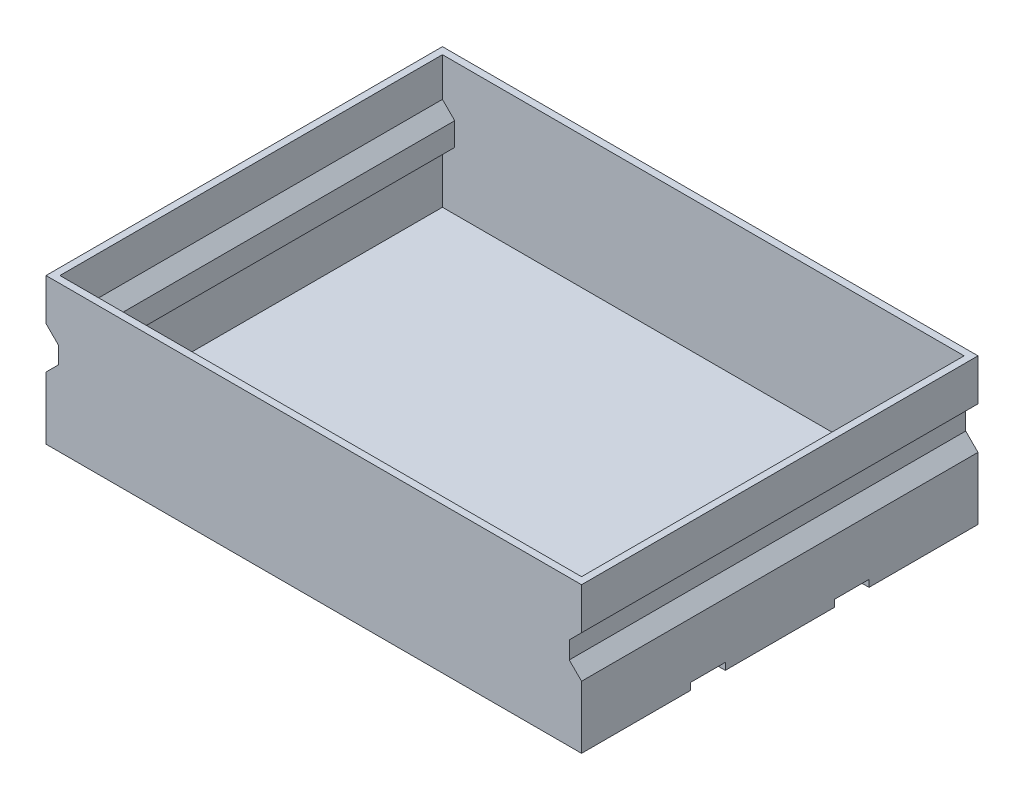
ISO-10303-21;
HEADER;
FILE_DESCRIPTION(('STEP AP214'),'2;1');
FILE_NAME('part.step','',(''),(''),'','','');
FILE_SCHEMA(('AUTOMOTIVE_DESIGN { 1 0 10303 214 1 1 1 1 }'));
ENDSEC;
DATA;
#1=APPLICATION_CONTEXT('core data for automotive mechanical design processes');
#2=APPLICATION_PROTOCOL_DEFINITION('international standard','automotive_design',2000,#1);
#3=PRODUCT_CONTEXT('',#1,'mechanical');
#4=PRODUCT('Part','Part','',(#3));
#5=PRODUCT_RELATED_PRODUCT_CATEGORY('part','',(#4));
#6=PRODUCT_DEFINITION_FORMATION('','',#4);
#7=PRODUCT_DEFINITION_CONTEXT('part definition',#1,'design');
#8=PRODUCT_DEFINITION('design','',#6,#7);
#9=PRODUCT_DEFINITION_SHAPE('','',#8);
#10=(LENGTH_UNIT() NAMED_UNIT(*) SI_UNIT(.MILLI.,.METRE.));
#11=(NAMED_UNIT(*) PLANE_ANGLE_UNIT() SI_UNIT($,.RADIAN.));
#12=(NAMED_UNIT(*) SI_UNIT($,.STERADIAN.) SOLID_ANGLE_UNIT());
#13=UNCERTAINTY_MEASURE_WITH_UNIT(LENGTH_MEASURE(1.E-05),#10,'distance_accuracy_value','');
#14=(GEOMETRIC_REPRESENTATION_CONTEXT(3) GLOBAL_UNCERTAINTY_ASSIGNED_CONTEXT((#13)) GLOBAL_UNIT_ASSIGNED_CONTEXT((#10,
#11,#12)) REPRESENTATION_CONTEXT('',''));
#15=CARTESIAN_POINT('',(0.,0.,0.));
#16=DIRECTION('',(0.,0.,1.));
#17=DIRECTION('',(1.,0.,0.));
#18=AXIS2_PLACEMENT_3D('',#15,#16,#17);
#19=CARTESIAN_POINT('',(0.,-2.,0.));
#20=DIRECTION('',(0.,1.,0.));
#21=DIRECTION('',(0.,0.,1.));
#22=AXIS2_PLACEMENT_3D('',#19,#20,#21);
#23=PLANE('',#22);
#24=DIRECTION('',(1.,0.,0.));
#25=VECTOR('',#24,1.);
#26=CARTESIAN_POINT('',(-77.,-2.,25.6666666666667));
#27=LINE('',#26,#25);
#28=CARTESIAN_POINT('',(-77.,-2.,25.6666666666667));
#29=VERTEX_POINT('',#28);
#30=CARTESIAN_POINT('',(77.,-2.,25.6666666666667));
#31=VERTEX_POINT('',#30);
#32=EDGE_CURVE('E266',#29,#31,#27,.T.);
#33=ORIENTED_EDGE('',*,*,#32,.F.);
#34=DIRECTION('',(0.,0.,1.));
#35=VECTOR('',#34,1.);
#36=CARTESIAN_POINT('',(-77.,-2.,0.));
#37=LINE('',#36,#35);
#38=CARTESIAN_POINT('',(-77.,-2.,15.6666666666667));
#39=VERTEX_POINT('',#38);
#40=EDGE_CURVE('E270',#39,#29,#37,.T.);
#41=ORIENTED_EDGE('',*,*,#40,.F.);
#42=DIRECTION('',(-1.,0.,0.));
#43=VECTOR('',#42,1.);
#44=CARTESIAN_POINT('',(-77.,-2.,15.6666666666667));
#45=LINE('',#44,#43);
#46=CARTESIAN_POINT('',(77.,-2.,15.6666666666667));
#47=VERTEX_POINT('',#46);
#48=EDGE_CURVE('E273',#47,#39,#45,.T.);
#49=ORIENTED_EDGE('',*,*,#48,.F.);
#50=DIRECTION('',(0.,0.,1.));
#51=VECTOR('',#50,1.);
#52=CARTESIAN_POINT('',(77.,-2.,0.));
#53=LINE('',#52,#51);
#54=EDGE_CURVE('E439',#47,#31,#53,.T.);
#55=ORIENTED_EDGE('',*,*,#54,.T.);
#56=EDGE_LOOP('',(#33,#41,#49,#55));
#57=FACE_BOUND('',#56,.T.);
#58=ADVANCED_FACE('F35',(#57),#23,.F.);
#59=DIRECTION('',(1.,0.,0.));
#60=VECTOR('',#59,1.);
#61=CARTESIAN_POINT('',(-77.,-2.,-15.6666666666667));
#62=LINE('',#61,#60);
#63=CARTESIAN_POINT('',(-77.,-2.,-15.6666666666667));
#64=VERTEX_POINT('',#63);
#65=CARTESIAN_POINT('',(77.,-2.,-15.6666666666667));
#66=VERTEX_POINT('',#65);
#67=EDGE_CURVE('E271',#64,#66,#62,.T.);
#68=ORIENTED_EDGE('',*,*,#67,.F.);
#69=CARTESIAN_POINT('',(-77.,-2.,-25.6666666666667));
#70=VERTEX_POINT('',#69);
#71=EDGE_CURVE('E476',#70,#64,#37,.T.);
#72=ORIENTED_EDGE('',*,*,#71,.F.);
#73=DIRECTION('',(-1.,0.,0.));
#74=VECTOR('',#73,1.);
#75=CARTESIAN_POINT('',(-77.,-2.,-25.6666666666667));
#76=LINE('',#75,#74);
#77=CARTESIAN_POINT('',(77.,-2.,-25.6666666666667));
#78=VERTEX_POINT('',#77);
#79=EDGE_CURVE('E60',#78,#70,#76,.T.);
#80=ORIENTED_EDGE('',*,*,#79,.F.);
#81=EDGE_CURVE('E474',#78,#66,#53,.T.);
#82=ORIENTED_EDGE('',*,*,#81,.T.);
#83=EDGE_LOOP('',(#68,#72,#80,#82));
#84=FACE_BOUND('',#83,.T.);
#85=ADVANCED_FACE('F517',(#84),#23,.F.);
#86=CARTESIAN_POINT('',(0.,0.,0.));
#87=DIRECTION('',(0.,1.,0.));
#88=DIRECTION('',(0.,0.,1.));
#89=AXIS2_PLACEMENT_3D('',#86,#87,#88);
#90=PLANE('',#89);
#91=DIRECTION('',(-1.,0.,0.));
#92=VECTOR('',#91,1.);
#93=CARTESIAN_POINT('',(-74.9999999999991,0.,55.));
#94=LINE('',#93,#92);
#95=CARTESIAN_POINT('',(74.9999999999991,0.,55.));
#96=VERTEX_POINT('',#95);
#97=CARTESIAN_POINT('',(-74.9999999999991,0.,55.));
#98=VERTEX_POINT('',#97);
#99=EDGE_CURVE('E327',#96,#98,#94,.T.);
#100=ORIENTED_EDGE('',*,*,#99,.F.);
#101=DIRECTION('',(0.,0.,-1.));
#102=VECTOR('',#101,1.);
#103=CARTESIAN_POINT('',(74.9999999999991,0.,95.401069459375));
#104=LINE('',#103,#102);
#105=CARTESIAN_POINT('',(74.9999999999991,0.,-55.));
#106=VERTEX_POINT('',#105);
#107=EDGE_CURVE('E415',#96,#106,#104,.T.);
#108=ORIENTED_EDGE('',*,*,#107,.T.);
#109=DIRECTION('',(-1.,0.,0.));
#110=VECTOR('',#109,1.);
#111=CARTESIAN_POINT('',(-74.9999999999991,0.,-55.));
#112=LINE('',#111,#110);
#113=CARTESIAN_POINT('',(-74.9999999999991,0.,-55.));
#114=VERTEX_POINT('',#113);
#115=EDGE_CURVE('E352',#106,#114,#112,.T.);
#116=ORIENTED_EDGE('',*,*,#115,.T.);
#117=DIRECTION('',(0.,0.,-1.));
#118=VECTOR('',#117,1.);
#119=CARTESIAN_POINT('',(-74.9999999999991,0.,95.401069459375));
#120=LINE('',#119,#118);
#121=EDGE_CURVE('E435',#98,#114,#120,.T.);
#122=ORIENTED_EDGE('',*,*,#121,.F.);
#123=EDGE_LOOP('',(#100,#108,#116,#122));
#124=FACE_BOUND('',#123,.T.);
#125=ADVANCED_FACE('F539',(#124),#90,.T.);
#126=CARTESIAN_POINT('',(77.,-2.,0.));
#127=DIRECTION('',(-1.,0.,0.));
#128=DIRECTION('',(0.,0.,1.));
#129=AXIS2_PLACEMENT_3D('',#126,#127,#128);
#130=PLANE('',#129);
#131=DIRECTION('',(0.,1.,0.));
#132=VECTOR('',#131,1.);
#133=CARTESIAN_POINT('',(77.,-2.,-57.));
#134=LINE('',#133,#132);
#135=CARTESIAN_POINT('',(77.,-4.,-57.));
#136=VERTEX_POINT('',#135);
#137=CARTESIAN_POINT('',(77.,13.9644660940671,-57.));
#138=VERTEX_POINT('',#137);
#139=EDGE_CURVE('E39',#136,#138,#134,.T.);
#140=ORIENTED_EDGE('',*,*,#139,.T.);
#141=DIRECTION('',(0.,0.,-1.));
#142=VECTOR('',#141,1.);
#143=CARTESIAN_POINT('',(77.,13.9644660940671,95.401069459375));
#144=LINE('',#143,#142);
#145=CARTESIAN_POINT('',(77.,13.9644660940671,57.));
#146=VERTEX_POINT('',#145);
#147=EDGE_CURVE('E417',#146,#138,#144,.T.);
#148=ORIENTED_EDGE('',*,*,#147,.F.);
#149=DIRECTION('',(0.,1.,0.));
#150=VECTOR('',#149,1.);
#151=CARTESIAN_POINT('',(77.,-2.,57.));
#152=LINE('',#151,#150);
#153=CARTESIAN_POINT('',(77.,-4.,57.));
#154=VERTEX_POINT('',#153);
#155=EDGE_CURVE('E11',#154,#146,#152,.T.);
#156=ORIENTED_EDGE('',*,*,#155,.F.);
#157=DIRECTION('',(0.,0.,1.));
#158=VECTOR('',#157,1.);
#159=CARTESIAN_POINT('',(77.,-4.,25.6666666666667));
#160=LINE('',#159,#158);
#161=CARTESIAN_POINT('',(77.,-4.,25.6666666666667));
#162=VERTEX_POINT('',#161);
#163=EDGE_CURVE('E258',#162,#154,#160,.T.);
#164=ORIENTED_EDGE('',*,*,#163,.F.);
#165=DIRECTION('',(0.,1.,0.));
#166=VECTOR('',#165,1.);
#167=CARTESIAN_POINT('',(77.,-4.,25.6666666666667));
#168=LINE('',#167,#166);
#169=EDGE_CURVE('E254',#162,#31,#168,.T.);
#170=ORIENTED_EDGE('',*,*,#169,.T.);
#171=ORIENTED_EDGE('',*,*,#54,.F.);
#172=DIRECTION('',(0.,1.,0.));
#173=VECTOR('',#172,1.);
#174=CARTESIAN_POINT('',(77.,-4.,15.6666666666667));
#175=LINE('',#174,#173);
#176=CARTESIAN_POINT('',(77.,-4.,15.6666666666667));
#177=VERTEX_POINT('',#176);
#178=EDGE_CURVE('E289',#177,#47,#175,.T.);
#179=ORIENTED_EDGE('',*,*,#178,.F.);
#180=DIRECTION('',(0.,0.,1.));
#181=VECTOR('',#180,1.);
#182=CARTESIAN_POINT('',(77.,-4.,-15.6666666666667));
#183=LINE('',#182,#181);
#184=CARTESIAN_POINT('',(77.,-4.,-15.6666666666667));
#185=VERTEX_POINT('',#184);
#186=EDGE_CURVE('E283',#185,#177,#183,.T.);
#187=ORIENTED_EDGE('',*,*,#186,.F.);
#188=DIRECTION('',(0.,1.,0.));
#189=VECTOR('',#188,1.);
#190=CARTESIAN_POINT('',(77.,-4.,-15.6666666666667));
#191=LINE('',#190,#189);
#192=EDGE_CURVE('E291',#185,#66,#191,.T.);
#193=ORIENTED_EDGE('',*,*,#192,.T.);
#194=ORIENTED_EDGE('',*,*,#81,.F.);
#195=DIRECTION('',(0.,1.,0.));
#196=VECTOR('',#195,1.);
#197=CARTESIAN_POINT('',(77.,-4.,-25.6666666666667));
#198=LINE('',#197,#196);
#199=CARTESIAN_POINT('',(77.,-4.,-25.6666666666667));
#200=VERTEX_POINT('',#199);
#201=EDGE_CURVE('E310',#200,#78,#198,.T.);
#202=ORIENTED_EDGE('',*,*,#201,.F.);
#203=DIRECTION('',(0.,0.,1.));
#204=VECTOR('',#203,1.);
#205=CARTESIAN_POINT('',(77.,-4.,-57.));
#206=LINE('',#205,#204);
#207=EDGE_CURVE('E302',#136,#200,#206,.T.);
#208=ORIENTED_EDGE('',*,*,#207,.F.);
#209=EDGE_LOOP('',(#140,#148,#156,#164,#170,#171,#179,#187,#193,#194,#202,#208));
#210=FACE_BOUND('',#209,.T.);
#211=ADVANCED_FACE('F37',(#210),#130,.F.);
#212=CARTESIAN_POINT('',(0.,-2.,57.));
#213=DIRECTION('',(0.,0.,1.));
#214=DIRECTION('',(1.,0.,0.));
#215=AXIS2_PLACEMENT_3D('',#212,#213,#214);
#216=PLANE('',#215);
#217=DIRECTION('',(0.,1.,0.));
#218=VECTOR('',#217,1.);
#219=CARTESIAN_POINT('',(76.9999999999998,26.0355339059327,57.));
#220=LINE('',#219,#218);
#221=CARTESIAN_POINT('',(76.9999999999998,26.0355339059327,57.));
#222=VERTEX_POINT('',#221);
#223=CARTESIAN_POINT('',(77.,38.,57.));
#224=VERTEX_POINT('',#223);
#225=EDGE_CURVE('E390',#222,#224,#220,.T.);
#226=ORIENTED_EDGE('',*,*,#225,.T.);
#227=DIRECTION('',(-1.,0.,0.));
#228=VECTOR('',#227,1.);
#229=CARTESIAN_POINT('',(-77.,38.,57.));
#230=LINE('',#229,#228);
#231=CARTESIAN_POINT('',(-77.,38.,57.));
#232=VERTEX_POINT('',#231);
#233=EDGE_CURVE('E449',#224,#232,#230,.T.);
#234=ORIENTED_EDGE('',*,*,#233,.T.);
#235=DIRECTION('',(0.,-1.,0.));
#236=VECTOR('',#235,1.);
#237=CARTESIAN_POINT('',(-76.9999999999998,26.0355339059328,57.));
#238=LINE('',#237,#236);
#239=CARTESIAN_POINT('',(-76.9999999999998,26.0355339059328,57.));
#240=VERTEX_POINT('',#239);
#241=EDGE_CURVE('E446',#232,#240,#238,.T.);
#242=ORIENTED_EDGE('',*,*,#241,.T.);
#243=DIRECTION('',(0.707106781186543,-0.707106781186552,0.));
#244=VECTOR('',#243,1.);
#245=CARTESIAN_POINT('',(-73.4644660940671,22.5,57.));
#246=LINE('',#245,#244);
#247=CARTESIAN_POINT('',(-73.4644660940671,22.5,57.));
#248=VERTEX_POINT('',#247);
#249=EDGE_CURVE('E443',#240,#248,#246,.T.);
#250=ORIENTED_EDGE('',*,*,#249,.T.);
#251=DIRECTION('',(0.,-1.,0.));
#252=VECTOR('',#251,1.);
#253=CARTESIAN_POINT('',(-73.4644660940671,17.5,57.));
#254=LINE('',#253,#252);
#255=CARTESIAN_POINT('',(-73.4644660940671,17.5,57.));
#256=VERTEX_POINT('',#255);
#257=EDGE_CURVE('E440',#248,#256,#254,.T.);
#258=ORIENTED_EDGE('',*,*,#257,.T.);
#259=DIRECTION('',(-0.707106781186552,-0.707106781186543,0.));
#260=VECTOR('',#259,1.);
#261=CARTESIAN_POINT('',(-77.,13.9644660940671,57.));
#262=LINE('',#261,#260);
#263=CARTESIAN_POINT('',(-77.,13.9644660940671,57.));
#264=VERTEX_POINT('',#263);
#265=EDGE_CURVE('E436',#256,#264,#262,.T.);
#266=ORIENTED_EDGE('',*,*,#265,.T.);
#267=DIRECTION('',(0.,1.,0.));
#268=VECTOR('',#267,1.);
#269=CARTESIAN_POINT('',(-77.,-2.,57.));
#270=LINE('',#269,#268);
#271=CARTESIAN_POINT('',(-77.,-4.,57.));
#272=VERTEX_POINT('',#271);
#273=EDGE_CURVE('E44',#272,#264,#270,.T.);
#274=ORIENTED_EDGE('',*,*,#273,.F.);
#275=DIRECTION('',(-1.,0.,0.));
#276=VECTOR('',#275,1.);
#277=CARTESIAN_POINT('',(-77.,-4.,57.));
#278=LINE('',#277,#276);
#279=EDGE_CURVE('E265',#154,#272,#278,.T.);
#280=ORIENTED_EDGE('',*,*,#279,.F.);
#281=ORIENTED_EDGE('',*,*,#155,.T.);
#282=DIRECTION('',(-0.707106781186559,0.707106781186537,0.));
#283=VECTOR('',#282,1.);
#284=CARTESIAN_POINT('',(77.,13.9644660940671,57.));
#285=LINE('',#284,#283);
#286=CARTESIAN_POINT('',(73.4644660940671,17.5,57.));
#287=VERTEX_POINT('',#286);
#288=EDGE_CURVE('E386',#146,#287,#285,.T.);
#289=ORIENTED_EDGE('',*,*,#288,.T.);
#290=DIRECTION('',(0.,1.,0.));
#291=VECTOR('',#290,1.);
#292=CARTESIAN_POINT('',(73.4644660940671,17.5,57.));
#293=LINE('',#292,#291);
#294=CARTESIAN_POINT('',(73.4644660940671,22.5,57.));
#295=VERTEX_POINT('',#294);
#296=EDGE_CURVE('E396',#287,#295,#293,.T.);
#297=ORIENTED_EDGE('',*,*,#296,.T.);
#298=DIRECTION('',(0.70710678118655,0.707106781186545,0.));
#299=VECTOR('',#298,1.);
#300=CARTESIAN_POINT('',(73.4644660940671,22.5,57.));
#301=LINE('',#300,#299);
#302=EDGE_CURVE('E393',#295,#222,#301,.T.);
#303=ORIENTED_EDGE('',*,*,#302,.T.);
#304=EDGE_LOOP('',(#226,#234,#242,#250,#258,#266,#274,#280,#281,#289,#297,#303));
#305=FACE_BOUND('',#304,.T.);
#306=ADVANCED_FACE('F498',(#305),#216,.T.);
#307=CARTESIAN_POINT('',(-77.,-2.,0.));
#308=DIRECTION('',(-1.,0.,0.));
#309=DIRECTION('',(0.,0.,1.));
#310=AXIS2_PLACEMENT_3D('',#307,#308,#309);
#311=PLANE('',#310);
#312=ORIENTED_EDGE('',*,*,#273,.T.);
#313=DIRECTION('',(0.,0.,-1.));
#314=VECTOR('',#313,1.);
#315=CARTESIAN_POINT('',(-77.,13.9644660940671,95.401069459375));
#316=LINE('',#315,#314);
#317=CARTESIAN_POINT('',(-77.,13.9644660940671,-57.));
#318=VERTEX_POINT('',#317);
#319=EDGE_CURVE('E452',#264,#318,#316,.T.);
#320=ORIENTED_EDGE('',*,*,#319,.T.);
#321=DIRECTION('',(0.,1.,0.));
#322=VECTOR('',#321,1.);
#323=CARTESIAN_POINT('',(-77.,-2.,-57.));
#324=LINE('',#323,#322);
#325=CARTESIAN_POINT('',(-77.,-4.,-57.));
#326=VERTEX_POINT('',#325);
#327=EDGE_CURVE('E479',#326,#318,#324,.T.);
#328=ORIENTED_EDGE('',*,*,#327,.F.);
#329=DIRECTION('',(0.,0.,-1.));
#330=VECTOR('',#329,1.);
#331=CARTESIAN_POINT('',(-77.,-4.,-57.));
#332=LINE('',#331,#330);
#333=CARTESIAN_POINT('',(-77.,-4.,-25.6666666666667));
#334=VERTEX_POINT('',#333);
#335=EDGE_CURVE('E296',#334,#326,#332,.T.);
#336=ORIENTED_EDGE('',*,*,#335,.F.);
#337=DIRECTION('',(0.,1.,0.));
#338=VECTOR('',#337,1.);
#339=CARTESIAN_POINT('',(-77.,-4.,-25.6666666666667));
#340=LINE('',#339,#338);
#341=EDGE_CURVE('E306',#334,#70,#340,.T.);
#342=ORIENTED_EDGE('',*,*,#341,.T.);
#343=ORIENTED_EDGE('',*,*,#71,.T.);
#344=DIRECTION('',(0.,1.,0.));
#345=VECTOR('',#344,1.);
#346=CARTESIAN_POINT('',(-77.,-4.,-15.6666666666667));
#347=LINE('',#346,#345);
#348=CARTESIAN_POINT('',(-77.,-4.,-15.6666666666667));
#349=VERTEX_POINT('',#348);
#350=EDGE_CURVE('E294',#349,#64,#347,.T.);
#351=ORIENTED_EDGE('',*,*,#350,.F.);
#352=DIRECTION('',(0.,0.,-1.));
#353=VECTOR('',#352,1.);
#354=CARTESIAN_POINT('',(-77.,-4.,-15.6666666666667));
#355=LINE('',#354,#353);
#356=CARTESIAN_POINT('',(-77.,-4.,15.6666666666667));
#357=VERTEX_POINT('',#356);
#358=EDGE_CURVE('E278',#357,#349,#355,.T.);
#359=ORIENTED_EDGE('',*,*,#358,.F.);
#360=DIRECTION('',(0.,1.,0.));
#361=VECTOR('',#360,1.);
#362=CARTESIAN_POINT('',(-77.,-4.,15.6666666666667));
#363=LINE('',#362,#361);
#364=EDGE_CURVE('E52',#357,#39,#363,.T.);
#365=ORIENTED_EDGE('',*,*,#364,.T.);
#366=ORIENTED_EDGE('',*,*,#40,.T.);
#367=DIRECTION('',(0.,1.,0.));
#368=VECTOR('',#367,1.);
#369=CARTESIAN_POINT('',(-77.,-4.,25.6666666666667));
#370=LINE('',#369,#368);
#371=CARTESIAN_POINT('',(-77.,-4.,25.6666666666667));
#372=VERTEX_POINT('',#371);
#373=EDGE_CURVE('E251',#372,#29,#370,.T.);
#374=ORIENTED_EDGE('',*,*,#373,.F.);
#375=DIRECTION('',(0.,0.,-1.));
#376=VECTOR('',#375,1.);
#377=CARTESIAN_POINT('',(-77.,-4.,25.6666666666667));
#378=LINE('',#377,#376);
#379=EDGE_CURVE('E259',#272,#372,#378,.T.);
#380=ORIENTED_EDGE('',*,*,#379,.F.);
#381=EDGE_LOOP('',(#312,#320,#328,#336,#342,#343,#351,#359,#365,#366,#374,#380));
#382=FACE_BOUND('',#381,.T.);
#383=ADVANCED_FACE('F268',(#382),#311,.T.);
#384=CARTESIAN_POINT('',(0.,-2.,-57.));
#385=DIRECTION('',(0.,0.,1.));
#386=DIRECTION('',(1.,0.,0.));
#387=AXIS2_PLACEMENT_3D('',#384,#385,#386);
#388=PLANE('',#387);
#389=DIRECTION('',(1.,0.,0.));
#390=VECTOR('',#389,1.);
#391=CARTESIAN_POINT('',(-77.,38.,-57.));
#392=LINE('',#391,#390);
#393=CARTESIAN_POINT('',(-77.,38.,-57.));
#394=VERTEX_POINT('',#393);
#395=CARTESIAN_POINT('',(77.,38.,-57.));
#396=VERTEX_POINT('',#395);
#397=EDGE_CURVE('E389',#394,#396,#392,.T.);
#398=ORIENTED_EDGE('',*,*,#397,.T.);
#399=DIRECTION('',(0.,-1.,0.));
#400=VECTOR('',#399,1.);
#401=CARTESIAN_POINT('',(76.9999999999998,26.0355339059327,-57.));
#402=LINE('',#401,#400);
#403=CARTESIAN_POINT('',(76.9999999999998,26.0355339059327,-57.));
#404=VERTEX_POINT('',#403);
#405=EDGE_CURVE('E382',#396,#404,#402,.T.);
#406=ORIENTED_EDGE('',*,*,#405,.T.);
#407=DIRECTION('',(-0.70710678118655,-0.707106781186545,0.));
#408=VECTOR('',#407,1.);
#409=CARTESIAN_POINT('',(73.4644660940671,22.5,-57.));
#410=LINE('',#409,#408);
#411=CARTESIAN_POINT('',(73.4644660940671,22.5,-57.));
#412=VERTEX_POINT('',#411);
#413=EDGE_CURVE('E379',#404,#412,#410,.T.);
#414=ORIENTED_EDGE('',*,*,#413,.T.);
#415=DIRECTION('',(0.,-1.,0.));
#416=VECTOR('',#415,1.);
#417=CARTESIAN_POINT('',(73.4644660940671,17.5,-57.));
#418=LINE('',#417,#416);
#419=CARTESIAN_POINT('',(73.4644660940671,17.5,-57.));
#420=VERTEX_POINT('',#419);
#421=EDGE_CURVE('E376',#412,#420,#418,.T.);
#422=ORIENTED_EDGE('',*,*,#421,.T.);
#423=DIRECTION('',(0.707106781186558,-0.707106781186537,0.));
#424=VECTOR('',#423,1.);
#425=CARTESIAN_POINT('',(77.,13.9644660940671,-57.));
#426=LINE('',#425,#424);
#427=EDGE_CURVE('E373',#420,#138,#426,.T.);
#428=ORIENTED_EDGE('',*,*,#427,.T.);
#429=ORIENTED_EDGE('',*,*,#139,.F.);
#430=DIRECTION('',(1.,0.,0.));
#431=VECTOR('',#430,1.);
#432=CARTESIAN_POINT('',(-77.,-4.,-57.));
#433=LINE('',#432,#431);
#434=EDGE_CURVE('E299',#326,#136,#433,.T.);
#435=ORIENTED_EDGE('',*,*,#434,.F.);
#436=ORIENTED_EDGE('',*,*,#327,.T.);
#437=DIRECTION('',(0.707106781186552,0.707106781186543,0.));
#438=VECTOR('',#437,1.);
#439=CARTESIAN_POINT('',(-77.,13.9644660940671,-57.));
#440=LINE('',#439,#438);
#441=CARTESIAN_POINT('',(-73.4644660940671,17.5,-57.));
#442=VERTEX_POINT('',#441);
#443=EDGE_CURVE('E432',#318,#442,#440,.T.);
#444=ORIENTED_EDGE('',*,*,#443,.T.);
#445=DIRECTION('',(0.,1.,0.));
#446=VECTOR('',#445,1.);
#447=CARTESIAN_POINT('',(-73.4644660940671,17.5,-57.));
#448=LINE('',#447,#446);
#449=CARTESIAN_POINT('',(-73.4644660940671,22.5,-57.));
#450=VERTEX_POINT('',#449);
#451=EDGE_CURVE('E429',#442,#450,#448,.T.);
#452=ORIENTED_EDGE('',*,*,#451,.T.);
#453=DIRECTION('',(-0.707106781186543,0.707106781186552,0.));
#454=VECTOR('',#453,1.);
#455=CARTESIAN_POINT('',(-73.4644660940671,22.5,-57.));
#456=LINE('',#455,#454);
#457=CARTESIAN_POINT('',(-76.9999999999998,26.0355339059328,-57.));
#458=VERTEX_POINT('',#457);
#459=EDGE_CURVE('E426',#450,#458,#456,.T.);
#460=ORIENTED_EDGE('',*,*,#459,.T.);
#461=DIRECTION('',(0.,1.,0.));
#462=VECTOR('',#461,1.);
#463=CARTESIAN_POINT('',(-76.9999999999998,26.0355339059328,-57.));
#464=LINE('',#463,#462);
#465=EDGE_CURVE('E423',#458,#394,#464,.T.);
#466=ORIENTED_EDGE('',*,*,#465,.T.);
#467=EDGE_LOOP('',(#398,#406,#414,#422,#428,#429,#435,#436,#444,#452,#460,#466));
#468=FACE_BOUND('',#467,.T.);
#469=ADVANCED_FACE('F490',(#468),#388,.F.);
#470=CARTESIAN_POINT('',(-74.9999999999992,13.1360389693205,95.401069459375));
#471=DIRECTION('',(-1.,0.,0.));
#472=DIRECTION('',(0.,-1.,0.));
#473=AXIS2_PLACEMENT_3D('',#470,#471,#472);
#474=PLANE('',#473);
#475=DIRECTION('',(0.,0.,-1.));
#476=VECTOR('',#475,1.);
#477=CARTESIAN_POINT('',(-74.9999999999992,13.1360389693205,95.401069459375));
#478=LINE('',#477,#476);
#479=CARTESIAN_POINT('',(-74.9999999999992,13.1360389693205,55.));
#480=VERTEX_POINT('',#479);
#481=CARTESIAN_POINT('',(-74.9999999999992,13.1360389693205,-55.));
#482=VERTEX_POINT('',#481);
#483=EDGE_CURVE('E454',#480,#482,#478,.T.);
#484=ORIENTED_EDGE('',*,*,#483,.F.);
#485=DIRECTION('',(0.,1.,0.));
#486=VECTOR('',#485,1.);
#487=CARTESIAN_POINT('',(-74.9999999999992,13.1360389693205,55.));
#488=LINE('',#487,#486);
#489=EDGE_CURVE('E325',#98,#480,#488,.T.);
#490=ORIENTED_EDGE('',*,*,#489,.F.);
#491=ORIENTED_EDGE('',*,*,#121,.T.);
#492=DIRECTION('',(0.,1.,0.));
#493=VECTOR('',#492,1.);
#494=CARTESIAN_POINT('',(-74.9999999999992,13.1360389693205,-55.));
#495=LINE('',#494,#493);
#496=EDGE_CURVE('E355',#114,#482,#495,.T.);
#497=ORIENTED_EDGE('',*,*,#496,.T.);
#498=EDGE_LOOP('',(#484,#490,#491,#497));
#499=FACE_BOUND('',#498,.T.);
#500=ADVANCED_FACE('F542',(#499),#474,.F.);
#501=CARTESIAN_POINT('',(-71.4644660940664,16.6715728752532,95.401069459375));
#502=DIRECTION('',(-0.707106781186532,0.707106781186563,0.));
#503=DIRECTION('',(-0.707106781186563,-0.707106781186532,0.));
#504=AXIS2_PLACEMENT_3D('',#501,#502,#503);
#505=PLANE('',#504);
#506=DIRECTION('',(0.,0.,-1.));
#507=VECTOR('',#506,1.);
#508=CARTESIAN_POINT('',(-71.4644660940664,16.6715728752532,95.401069459375));
#509=LINE('',#508,#507);
#510=CARTESIAN_POINT('',(-71.4644660940664,16.6715728752531,55.));
#511=VERTEX_POINT('',#510);
#512=CARTESIAN_POINT('',(-71.4644660940664,16.6715728752531,-55.));
#513=VERTEX_POINT('',#512);
#514=EDGE_CURVE('E456',#511,#513,#509,.T.);
#515=ORIENTED_EDGE('',*,*,#514,.F.);
#516=DIRECTION('',(0.707106781186563,0.707106781186532,0.));
#517=VECTOR('',#516,1.);
#518=CARTESIAN_POINT('',(-71.4644660940664,16.6715728752531,55.));
#519=LINE('',#518,#517);
#520=EDGE_CURVE('E323',#480,#511,#519,.T.);
#521=ORIENTED_EDGE('',*,*,#520,.F.);
#522=ORIENTED_EDGE('',*,*,#483,.T.);
#523=DIRECTION('',(0.707106781186563,0.707106781186532,0.));
#524=VECTOR('',#523,1.);
#525=CARTESIAN_POINT('',(-71.4644660940664,16.6715728752531,-55.));
#526=LINE('',#525,#524);
#527=EDGE_CURVE('E358',#482,#513,#526,.T.);
#528=ORIENTED_EDGE('',*,*,#527,.T.);
#529=EDGE_LOOP('',(#515,#521,#522,#528));
#530=FACE_BOUND('',#529,.T.);
#531=ADVANCED_FACE('F554',(#530),#505,.F.);
#532=CARTESIAN_POINT('',(-71.4644660940664,22.5,95.401069459375));
#533=DIRECTION('',(-1.,0.,0.));
#534=DIRECTION('',(0.,-1.,0.));
#535=AXIS2_PLACEMENT_3D('',#532,#533,#534);
#536=PLANE('',#535);
#537=DIRECTION('',(0.,0.,-1.));
#538=VECTOR('',#537,1.);
#539=CARTESIAN_POINT('',(-71.4644660940664,23.3284271247461,95.401069459375));
#540=LINE('',#539,#538);
#541=CARTESIAN_POINT('',(-71.4644660940664,23.3284271247461,55.));
#542=VERTEX_POINT('',#541);
#543=CARTESIAN_POINT('',(-71.4644660940664,23.3284271247461,-55.));
#544=VERTEX_POINT('',#543);
#545=EDGE_CURVE('E458',#542,#544,#540,.T.);
#546=ORIENTED_EDGE('',*,*,#545,.F.);
#547=DIRECTION('',(0.,1.,0.));
#548=VECTOR('',#547,1.);
#549=CARTESIAN_POINT('',(-71.4644660940664,23.3284271247461,55.));
#550=LINE('',#549,#548);
#551=EDGE_CURVE('E321',#511,#542,#550,.T.);
#552=ORIENTED_EDGE('',*,*,#551,.F.);
#553=ORIENTED_EDGE('',*,*,#514,.T.);
#554=DIRECTION('',(0.,1.,0.));
#555=VECTOR('',#554,1.);
#556=CARTESIAN_POINT('',(-71.4644660940664,23.3284271247461,-55.));
#557=LINE('',#556,#555);
#558=EDGE_CURVE('E361',#513,#544,#557,.T.);
#559=ORIENTED_EDGE('',*,*,#558,.T.);
#560=EDGE_LOOP('',(#546,#552,#553,#559));
#561=FACE_BOUND('',#560,.T.);
#562=ADVANCED_FACE('F559',(#561),#536,.F.);
#563=CARTESIAN_POINT('',(-71.4644660940664,23.3284271247461,95.401069459375));
#564=DIRECTION('',(-0.707106781186547,-0.707106781186548,0.));
#565=DIRECTION('',(0.707106781186548,-0.707106781186547,0.));
#566=AXIS2_PLACEMENT_3D('',#563,#564,#565);
#567=PLANE('',#566);
#568=DIRECTION('',(0.,0.,-1.));
#569=VECTOR('',#568,1.);
#570=CARTESIAN_POINT('',(-74.9999999999991,26.8639610306788,95.401069459375));
#571=LINE('',#570,#569);
#572=CARTESIAN_POINT('',(-74.9999999999991,26.8639610306788,55.));
#573=VERTEX_POINT('',#572);
#574=CARTESIAN_POINT('',(-74.9999999999991,26.8639610306788,-55.));
#575=VERTEX_POINT('',#574);
#576=EDGE_CURVE('E460',#573,#575,#571,.T.);
#577=ORIENTED_EDGE('',*,*,#576,.F.);
#578=DIRECTION('',(-0.707106781186548,0.707106781186547,0.));
#579=VECTOR('',#578,1.);
#580=CARTESIAN_POINT('',(-74.9999999999991,26.8639610306788,55.));
#581=LINE('',#580,#579);
#582=EDGE_CURVE('E319',#542,#573,#581,.T.);
#583=ORIENTED_EDGE('',*,*,#582,.F.);
#584=ORIENTED_EDGE('',*,*,#545,.T.);
#585=DIRECTION('',(-0.707106781186548,0.707106781186547,0.));
#586=VECTOR('',#585,1.);
#587=CARTESIAN_POINT('',(-74.9999999999991,26.8639610306788,-55.));
#588=LINE('',#587,#586);
#589=EDGE_CURVE('E364',#544,#575,#588,.T.);
#590=ORIENTED_EDGE('',*,*,#589,.T.);
#591=EDGE_LOOP('',(#577,#583,#584,#590));
#592=FACE_BOUND('',#591,.T.);
#593=ADVANCED_FACE('F583',(#592),#567,.F.);
#594=CARTESIAN_POINT('',(-74.9999999999991,38.,95.401069459375));
#595=DIRECTION('',(-1.,0.,0.));
#596=DIRECTION('',(0.,0.,1.));
#597=AXIS2_PLACEMENT_3D('',#594,#595,#596);
#598=PLANE('',#597);
#599=DIRECTION('',(0.,0.,-1.));
#600=VECTOR('',#599,1.);
#601=CARTESIAN_POINT('',(-74.9999999999991,38.,95.401069459375));
#602=LINE('',#601,#600);
#603=CARTESIAN_POINT('',(-74.9999999999991,38.,55.));
#604=VERTEX_POINT('',#603);
#605=CARTESIAN_POINT('',(-74.9999999999991,38.,-55.));
#606=VERTEX_POINT('',#605);
#607=EDGE_CURVE('E462',#604,#606,#602,.T.);
#608=ORIENTED_EDGE('',*,*,#607,.F.);
#609=DIRECTION('',(0.,1.,0.));
#610=VECTOR('',#609,1.);
#611=CARTESIAN_POINT('',(-74.9999999999991,38.,55.));
#612=LINE('',#611,#610);
#613=EDGE_CURVE('E317',#573,#604,#612,.T.);
#614=ORIENTED_EDGE('',*,*,#613,.F.);
#615=ORIENTED_EDGE('',*,*,#576,.T.);
#616=DIRECTION('',(0.,1.,0.));
#617=VECTOR('',#616,1.);
#618=CARTESIAN_POINT('',(-74.9999999999991,38.,-55.));
#619=LINE('',#618,#617);
#620=EDGE_CURVE('E367',#575,#606,#619,.T.);
#621=ORIENTED_EDGE('',*,*,#620,.T.);
#622=EDGE_LOOP('',(#608,#614,#615,#621));
#623=FACE_BOUND('',#622,.T.);
#624=ADVANCED_FACE('F586',(#623),#598,.F.);
#625=CARTESIAN_POINT('',(-77.,38.,95.401069459375));
#626=DIRECTION('',(0.,-1.,0.));
#627=DIRECTION('',(0.,0.,-1.));
#628=AXIS2_PLACEMENT_3D('',#625,#626,#627);
#629=PLANE('',#628);
#630=DIRECTION('',(1.,0.,0.));
#631=VECTOR('',#630,1.);
#632=CARTESIAN_POINT('',(74.9999999999991,38.,55.));
#633=LINE('',#632,#631);
#634=CARTESIAN_POINT('',(74.9999999999991,38.,55.));
#635=VERTEX_POINT('',#634);
#636=EDGE_CURVE('E315',#604,#635,#633,.T.);
#637=ORIENTED_EDGE('',*,*,#636,.F.);
#638=ORIENTED_EDGE('',*,*,#607,.T.);
#639=DIRECTION('',(1.,0.,0.));
#640=VECTOR('',#639,1.);
#641=CARTESIAN_POINT('',(74.9999999999991,38.,-55.));
#642=LINE('',#641,#640);
#643=CARTESIAN_POINT('',(74.9999999999991,38.,-55.));
#644=VERTEX_POINT('',#643);
#645=EDGE_CURVE('E370',#606,#644,#642,.T.);
#646=ORIENTED_EDGE('',*,*,#645,.T.);
#647=DIRECTION('',(0.,0.,-1.));
#648=VECTOR('',#647,1.);
#649=CARTESIAN_POINT('',(74.9999999999991,38.,95.401069459375));
#650=LINE('',#649,#648);
#651=EDGE_CURVE('E405',#635,#644,#650,.T.);
#652=ORIENTED_EDGE('',*,*,#651,.F.);
#653=EDGE_LOOP('',(#637,#638,#646,#652));
#654=FACE_BOUND('',#653,.T.);
#655=ORIENTED_EDGE('',*,*,#233,.F.);
#656=DIRECTION('',(0.,0.,-1.));
#657=VECTOR('',#656,1.);
#658=CARTESIAN_POINT('',(77.,38.,95.401069459375));
#659=LINE('',#658,#657);
#660=EDGE_CURVE('E402',#224,#396,#659,.T.);
#661=ORIENTED_EDGE('',*,*,#660,.T.);
#662=ORIENTED_EDGE('',*,*,#397,.F.);
#663=DIRECTION('',(0.,0.,-1.));
#664=VECTOR('',#663,1.);
#665=CARTESIAN_POINT('',(-77.,38.,95.401069459375));
#666=LINE('',#665,#664);
#667=EDGE_CURVE('E464',#232,#394,#666,.T.);
#668=ORIENTED_EDGE('',*,*,#667,.F.);
#669=EDGE_LOOP('',(#655,#661,#662,#668));
#670=FACE_BOUND('',#669,.T.);
#671=ADVANCED_FACE('F592',(#654,#670),#629,.F.);
#672=CARTESIAN_POINT('',(-76.9999999999998,26.0355339059328,95.401069459375));
#673=DIRECTION('',(1.,0.,0.));
#674=DIRECTION('',(0.,1.,0.));
#675=AXIS2_PLACEMENT_3D('',#672,#673,#674);
#676=PLANE('',#675);
#677=ORIENTED_EDGE('',*,*,#241,.F.);
#678=ORIENTED_EDGE('',*,*,#667,.T.);
#679=ORIENTED_EDGE('',*,*,#465,.F.);
#680=DIRECTION('',(0.,0.,-1.));
#681=VECTOR('',#680,1.);
#682=CARTESIAN_POINT('',(-76.9999999999998,26.0355339059328,95.401069459375));
#683=LINE('',#682,#681);
#684=EDGE_CURVE('E466',#240,#458,#683,.T.);
#685=ORIENTED_EDGE('',*,*,#684,.F.);
#686=EDGE_LOOP('',(#677,#678,#679,#685));
#687=FACE_BOUND('',#686,.T.);
#688=ADVANCED_FACE('F653',(#687),#676,.F.);
#689=CARTESIAN_POINT('',(-73.4644660940671,22.5,95.401069459375));
#690=DIRECTION('',(0.707106781186552,0.707106781186543,0.));
#691=DIRECTION('',(-0.707106781186543,0.707106781186552,0.));
#692=AXIS2_PLACEMENT_3D('',#689,#690,#691);
#693=PLANE('',#692);
#694=ORIENTED_EDGE('',*,*,#249,.F.);
#695=ORIENTED_EDGE('',*,*,#684,.T.);
#696=ORIENTED_EDGE('',*,*,#459,.F.);
#697=DIRECTION('',(0.,0.,-1.));
#698=VECTOR('',#697,1.);
#699=CARTESIAN_POINT('',(-73.4644660940671,22.5,95.401069459375));
#700=LINE('',#699,#698);
#701=EDGE_CURVE('E468',#248,#450,#700,.T.);
#702=ORIENTED_EDGE('',*,*,#701,.F.);
#703=EDGE_LOOP('',(#694,#695,#696,#702));
#704=FACE_BOUND('',#703,.T.);
#705=ADVANCED_FACE('F649',(#704),#693,.F.);
#706=CARTESIAN_POINT('',(-73.4644660940671,17.5,95.401069459375));
#707=DIRECTION('',(1.,0.,0.));
#708=DIRECTION('',(0.,0.,-1.));
#709=AXIS2_PLACEMENT_3D('',#706,#707,#708);
#710=PLANE('',#709);
#711=ORIENTED_EDGE('',*,*,#257,.F.);
#712=ORIENTED_EDGE('',*,*,#701,.T.);
#713=ORIENTED_EDGE('',*,*,#451,.F.);
#714=DIRECTION('',(0.,0.,-1.));
#715=VECTOR('',#714,1.);
#716=CARTESIAN_POINT('',(-73.4644660940671,17.5,95.401069459375));
#717=LINE('',#716,#715);
#718=EDGE_CURVE('E470',#256,#442,#717,.T.);
#719=ORIENTED_EDGE('',*,*,#718,.F.);
#720=EDGE_LOOP('',(#711,#712,#713,#719));
#721=FACE_BOUND('',#720,.T.);
#722=ADVANCED_FACE('F645',(#721),#710,.F.);
#723=CARTESIAN_POINT('',(-77.,13.9644660940671,95.401069459375));
#724=DIRECTION('',(0.707106781186543,-0.707106781186552,0.));
#725=DIRECTION('',(0.707106781186552,0.707106781186543,0.));
#726=AXIS2_PLACEMENT_3D('',#723,#724,#725);
#727=PLANE('',#726);
#728=ORIENTED_EDGE('',*,*,#265,.F.);
#729=ORIENTED_EDGE('',*,*,#718,.T.);
#730=ORIENTED_EDGE('',*,*,#443,.F.);
#731=ORIENTED_EDGE('',*,*,#319,.F.);
#732=EDGE_LOOP('',(#728,#729,#730,#731));
#733=FACE_BOUND('',#732,.T.);
#734=ADVANCED_FACE('F641',(#733),#727,.F.);
#735=CARTESIAN_POINT('',(73.4644660940671,22.5,95.401069459375));
#736=DIRECTION('',(-0.707106781186545,0.70710678118655,0.));
#737=DIRECTION('',(-0.70710678118655,-0.707106781186545,0.));
#738=AXIS2_PLACEMENT_3D('',#735,#736,#737);
#739=PLANE('',#738);
#740=ORIENTED_EDGE('',*,*,#302,.F.);
#741=DIRECTION('',(0.,0.,-1.));
#742=VECTOR('',#741,1.);
#743=CARTESIAN_POINT('',(73.4644660940671,22.5,95.401069459375));
#744=LINE('',#743,#742);
#745=EDGE_CURVE('E385',#295,#412,#744,.T.);
#746=ORIENTED_EDGE('',*,*,#745,.T.);
#747=ORIENTED_EDGE('',*,*,#413,.F.);
#748=DIRECTION('',(0.,0.,-1.));
#749=VECTOR('',#748,1.);
#750=CARTESIAN_POINT('',(76.9999999999998,26.0355339059327,95.401069459375));
#751=LINE('',#750,#749);
#752=EDGE_CURVE('E400',#222,#404,#751,.T.);
#753=ORIENTED_EDGE('',*,*,#752,.F.);
#754=EDGE_LOOP('',(#740,#746,#747,#753));
#755=FACE_BOUND('',#754,.T.);
#756=ADVANCED_FACE('F637',(#755),#739,.F.);
#757=CARTESIAN_POINT('',(76.9999999999998,26.0355339059327,95.401069459375));
#758=DIRECTION('',(-1.,0.,0.));
#759=DIRECTION('',(0.,-1.,0.));
#760=AXIS2_PLACEMENT_3D('',#757,#758,#759);
#761=PLANE('',#760);
#762=ORIENTED_EDGE('',*,*,#225,.F.);
#763=ORIENTED_EDGE('',*,*,#752,.T.);
#764=ORIENTED_EDGE('',*,*,#405,.F.);
#765=ORIENTED_EDGE('',*,*,#660,.F.);
#766=EDGE_LOOP('',(#762,#763,#764,#765));
#767=FACE_BOUND('',#766,.T.);
#768=ADVANCED_FACE('F634',(#767),#761,.F.);
#769=CARTESIAN_POINT('',(74.9999999999991,38.,95.401069459375));
#770=DIRECTION('',(1.,0.,0.));
#771=DIRECTION('',(0.,0.,-1.));
#772=AXIS2_PLACEMENT_3D('',#769,#770,#771);
#773=PLANE('',#772);
#774=DIRECTION('',(0.,0.,-1.));
#775=VECTOR('',#774,1.);
#776=CARTESIAN_POINT('',(74.9999999999991,26.8639610306788,95.401069459375));
#777=LINE('',#776,#775);
#778=CARTESIAN_POINT('',(74.9999999999991,26.8639610306788,55.));
#779=VERTEX_POINT('',#778);
#780=CARTESIAN_POINT('',(74.9999999999991,26.8639610306788,-55.));
#781=VERTEX_POINT('',#780);
#782=EDGE_CURVE('E407',#779,#781,#777,.T.);
#783=ORIENTED_EDGE('',*,*,#782,.F.);
#784=DIRECTION('',(0.,-1.,0.));
#785=VECTOR('',#784,1.);
#786=CARTESIAN_POINT('',(74.9999999999991,26.8639610306788,55.));
#787=LINE('',#786,#785);
#788=EDGE_CURVE('E313',#635,#779,#787,.T.);
#789=ORIENTED_EDGE('',*,*,#788,.F.);
#790=ORIENTED_EDGE('',*,*,#651,.T.);
#791=DIRECTION('',(0.,-1.,0.));
#792=VECTOR('',#791,1.);
#793=CARTESIAN_POINT('',(74.9999999999991,26.8639610306788,-55.));
#794=LINE('',#793,#792);
#795=EDGE_CURVE('E337',#644,#781,#794,.T.);
#796=ORIENTED_EDGE('',*,*,#795,.T.);
#797=EDGE_LOOP('',(#783,#789,#790,#796));
#798=FACE_BOUND('',#797,.T.);
#799=ADVANCED_FACE('F598',(#798),#773,.F.);
#800=CARTESIAN_POINT('',(71.4644660940664,23.3284271247461,95.401069459375));
#801=DIRECTION('',(0.707106781186547,-0.707106781186548,0.));
#802=DIRECTION('',(0.707106781186548,0.707106781186547,0.));
#803=AXIS2_PLACEMENT_3D('',#800,#801,#802);
#804=PLANE('',#803);
#805=DIRECTION('',(0.,0.,-1.));
#806=VECTOR('',#805,1.);
#807=CARTESIAN_POINT('',(71.4644660940664,23.3284271247461,95.401069459375));
#808=LINE('',#807,#806);
#809=CARTESIAN_POINT('',(71.4644660940664,23.3284271247461,55.));
#810=VERTEX_POINT('',#809);
#811=CARTESIAN_POINT('',(71.4644660940664,23.3284271247461,-55.));
#812=VERTEX_POINT('',#811);
#813=EDGE_CURVE('E409',#810,#812,#808,.T.);
#814=ORIENTED_EDGE('',*,*,#813,.F.);
#815=DIRECTION('',(-0.707106781186548,-0.707106781186547,0.));
#816=VECTOR('',#815,1.);
#817=CARTESIAN_POINT('',(71.4644660940664,23.3284271247461,55.));
#818=LINE('',#817,#816);
#819=EDGE_CURVE('E335',#779,#810,#818,.T.);
#820=ORIENTED_EDGE('',*,*,#819,.F.);
#821=ORIENTED_EDGE('',*,*,#782,.T.);
#822=DIRECTION('',(-0.707106781186548,-0.707106781186547,0.));
#823=VECTOR('',#822,1.);
#824=CARTESIAN_POINT('',(71.4644660940664,23.3284271247461,-55.));
#825=LINE('',#824,#823);
#826=EDGE_CURVE('E340',#781,#812,#825,.T.);
#827=ORIENTED_EDGE('',*,*,#826,.T.);
#828=EDGE_LOOP('',(#814,#820,#821,#827));
#829=FACE_BOUND('',#828,.T.);
#830=ADVANCED_FACE('F601',(#829),#804,.F.);
#831=CARTESIAN_POINT('',(71.4644660940664,17.5,95.401069459375));
#832=DIRECTION('',(1.,0.,0.));
#833=DIRECTION('',(0.,1.,0.));
#834=AXIS2_PLACEMENT_3D('',#831,#832,#833);
#835=PLANE('',#834);
#836=DIRECTION('',(0.,0.,-1.));
#837=VECTOR('',#836,1.);
#838=CARTESIAN_POINT('',(71.4644660940664,16.6715728752532,95.401069459375));
#839=LINE('',#838,#837);
#840=CARTESIAN_POINT('',(71.4644660940664,16.6715728752532,55.));
#841=VERTEX_POINT('',#840);
#842=CARTESIAN_POINT('',(71.4644660940664,16.6715728752532,-55.));
#843=VERTEX_POINT('',#842);
#844=EDGE_CURVE('E411',#841,#843,#839,.T.);
#845=ORIENTED_EDGE('',*,*,#844,.F.);
#846=DIRECTION('',(0.,-1.,0.));
#847=VECTOR('',#846,1.);
#848=CARTESIAN_POINT('',(71.4644660940664,16.6715728752532,55.));
#849=LINE('',#848,#847);
#850=EDGE_CURVE('E333',#810,#841,#849,.T.);
#851=ORIENTED_EDGE('',*,*,#850,.F.);
#852=ORIENTED_EDGE('',*,*,#813,.T.);
#853=DIRECTION('',(0.,-1.,0.));
#854=VECTOR('',#853,1.);
#855=CARTESIAN_POINT('',(71.4644660940664,16.6715728752532,-55.));
#856=LINE('',#855,#854);
#857=EDGE_CURVE('E343',#812,#843,#856,.T.);
#858=ORIENTED_EDGE('',*,*,#857,.T.);
#859=EDGE_LOOP('',(#845,#851,#852,#858));
#860=FACE_BOUND('',#859,.T.);
#861=ADVANCED_FACE('F607',(#860),#835,.F.);
#862=CARTESIAN_POINT('',(71.4644660940664,16.6715728752532,95.401069459375));
#863=DIRECTION('',(0.707106781186532,0.707106781186563,0.));
#864=DIRECTION('',(-0.707106781186563,0.707106781186532,0.));
#865=AXIS2_PLACEMENT_3D('',#862,#863,#864);
#866=PLANE('',#865);
#867=DIRECTION('',(0.,0.,-1.));
#868=VECTOR('',#867,1.);
#869=CARTESIAN_POINT('',(74.9999999999992,13.1360389693205,95.401069459375));
#870=LINE('',#869,#868);
#871=CARTESIAN_POINT('',(74.9999999999992,13.1360389693205,55.));
#872=VERTEX_POINT('',#871);
#873=CARTESIAN_POINT('',(74.9999999999992,13.1360389693205,-55.));
#874=VERTEX_POINT('',#873);
#875=EDGE_CURVE('E413',#872,#874,#870,.T.);
#876=ORIENTED_EDGE('',*,*,#875,.F.);
#877=DIRECTION('',(0.707106781186563,-0.707106781186532,0.));
#878=VECTOR('',#877,1.);
#879=CARTESIAN_POINT('',(74.9999999999992,13.1360389693205,55.));
#880=LINE('',#879,#878);
#881=EDGE_CURVE('E331',#841,#872,#880,.T.);
#882=ORIENTED_EDGE('',*,*,#881,.F.);
#883=ORIENTED_EDGE('',*,*,#844,.T.);
#884=DIRECTION('',(0.707106781186563,-0.707106781186532,0.));
#885=VECTOR('',#884,1.);
#886=CARTESIAN_POINT('',(74.9999999999992,13.1360389693205,-55.));
#887=LINE('',#886,#885);
#888=EDGE_CURVE('E346',#843,#874,#887,.T.);
#889=ORIENTED_EDGE('',*,*,#888,.T.);
#890=EDGE_LOOP('',(#876,#882,#883,#889));
#891=FACE_BOUND('',#890,.T.);
#892=ADVANCED_FACE('F613',(#891),#866,.F.);
#893=CARTESIAN_POINT('',(74.9999999999992,13.1360389693205,95.401069459375));
#894=DIRECTION('',(1.,0.,0.));
#895=DIRECTION('',(0.,1.,0.));
#896=AXIS2_PLACEMENT_3D('',#893,#894,#895);
#897=PLANE('',#896);
#898=ORIENTED_EDGE('',*,*,#107,.F.);
#899=DIRECTION('',(0.,-1.,0.));
#900=VECTOR('',#899,1.);
#901=CARTESIAN_POINT('',(74.9999999999991,0.,55.));
#902=LINE('',#901,#900);
#903=EDGE_CURVE('E329',#872,#96,#902,.T.);
#904=ORIENTED_EDGE('',*,*,#903,.F.);
#905=ORIENTED_EDGE('',*,*,#875,.T.);
#906=DIRECTION('',(0.,-1.,0.));
#907=VECTOR('',#906,1.);
#908=CARTESIAN_POINT('',(74.9999999999991,0.,-55.));
#909=LINE('',#908,#907);
#910=EDGE_CURVE('E349',#874,#106,#909,.T.);
#911=ORIENTED_EDGE('',*,*,#910,.T.);
#912=EDGE_LOOP('',(#898,#904,#905,#911));
#913=FACE_BOUND('',#912,.T.);
#914=ADVANCED_FACE('F616',(#913),#897,.F.);
#915=CARTESIAN_POINT('',(77.,13.9644660940671,95.401069459375));
#916=DIRECTION('',(-0.707106781186536,-0.707106781186558,0.));
#917=DIRECTION('',(0.707106781186559,-0.707106781186537,0.));
#918=AXIS2_PLACEMENT_3D('',#915,#916,#917);
#919=PLANE('',#918);
#920=ORIENTED_EDGE('',*,*,#288,.F.);
#921=ORIENTED_EDGE('',*,*,#147,.T.);
#922=ORIENTED_EDGE('',*,*,#427,.F.);
#923=DIRECTION('',(0.,0.,-1.));
#924=VECTOR('',#923,1.);
#925=CARTESIAN_POINT('',(73.4644660940671,17.5,95.401069459375));
#926=LINE('',#925,#924);
#927=EDGE_CURVE('E399',#287,#420,#926,.T.);
#928=ORIENTED_EDGE('',*,*,#927,.F.);
#929=EDGE_LOOP('',(#920,#921,#922,#928));
#930=FACE_BOUND('',#929,.T.);
#931=ADVANCED_FACE('F489',(#930),#919,.F.);
#932=CARTESIAN_POINT('',(73.4644660940671,17.5,95.401069459375));
#933=DIRECTION('',(-1.,0.,0.));
#934=DIRECTION('',(0.,0.,1.));
#935=AXIS2_PLACEMENT_3D('',#932,#933,#934);
#936=PLANE('',#935);
#937=ORIENTED_EDGE('',*,*,#296,.F.);
#938=ORIENTED_EDGE('',*,*,#927,.T.);
#939=ORIENTED_EDGE('',*,*,#421,.F.);
#940=ORIENTED_EDGE('',*,*,#745,.F.);
#941=EDGE_LOOP('',(#937,#938,#939,#940));
#942=FACE_BOUND('',#941,.T.);
#943=ADVANCED_FACE('F495',(#942),#936,.F.);
#944=CARTESIAN_POINT('',(0.,0.,-55.));
#945=DIRECTION('',(0.,0.,1.));
#946=DIRECTION('',(1.,0.,0.));
#947=AXIS2_PLACEMENT_3D('',#944,#945,#946);
#948=PLANE('',#947);
#949=ORIENTED_EDGE('',*,*,#795,.F.);
#950=ORIENTED_EDGE('',*,*,#645,.F.);
#951=ORIENTED_EDGE('',*,*,#620,.F.);
#952=ORIENTED_EDGE('',*,*,#589,.F.);
#953=ORIENTED_EDGE('',*,*,#558,.F.);
#954=ORIENTED_EDGE('',*,*,#527,.F.);
#955=ORIENTED_EDGE('',*,*,#496,.F.);
#956=ORIENTED_EDGE('',*,*,#115,.F.);
#957=ORIENTED_EDGE('',*,*,#910,.F.);
#958=ORIENTED_EDGE('',*,*,#888,.F.);
#959=ORIENTED_EDGE('',*,*,#857,.F.);
#960=ORIENTED_EDGE('',*,*,#826,.F.);
#961=EDGE_LOOP('',(#949,#950,#951,#952,#953,#954,#955,#956,#957,#958,#959,#960));
#962=FACE_BOUND('',#961,.T.);
#963=ADVANCED_FACE('F571',(#962),#948,.T.);
#964=CARTESIAN_POINT('',(0.,0.,55.));
#965=DIRECTION('',(0.,0.,-1.));
#966=DIRECTION('',(1.,0.,0.));
#967=AXIS2_PLACEMENT_3D('',#964,#965,#966);
#968=PLANE('',#967);
#969=ORIENTED_EDGE('',*,*,#788,.T.);
#970=ORIENTED_EDGE('',*,*,#819,.T.);
#971=ORIENTED_EDGE('',*,*,#850,.T.);
#972=ORIENTED_EDGE('',*,*,#881,.T.);
#973=ORIENTED_EDGE('',*,*,#903,.T.);
#974=ORIENTED_EDGE('',*,*,#99,.T.);
#975=ORIENTED_EDGE('',*,*,#489,.T.);
#976=ORIENTED_EDGE('',*,*,#520,.T.);
#977=ORIENTED_EDGE('',*,*,#551,.T.);
#978=ORIENTED_EDGE('',*,*,#582,.T.);
#979=ORIENTED_EDGE('',*,*,#613,.T.);
#980=ORIENTED_EDGE('',*,*,#636,.T.);
#981=EDGE_LOOP('',(#969,#970,#971,#972,#973,#974,#975,#976,#977,#978,#979,#980));
#982=FACE_BOUND('',#981,.T.);
#983=ADVANCED_FACE('F532',(#982),#968,.T.);
#984=CARTESIAN_POINT('',(-77.,-4.,-25.6666666666667));
#985=DIRECTION('',(0.,0.,-1.));
#986=DIRECTION('',(-1.,0.,0.));
#987=AXIS2_PLACEMENT_3D('',#984,#985,#986);
#988=PLANE('',#987);
#989=ORIENTED_EDGE('',*,*,#79,.T.);
#990=ORIENTED_EDGE('',*,*,#341,.F.);
#991=DIRECTION('',(-1.,0.,0.));
#992=VECTOR('',#991,1.);
#993=CARTESIAN_POINT('',(-77.,-4.,-25.6666666666667));
#994=LINE('',#993,#992);
#995=EDGE_CURVE('E304',#200,#334,#994,.T.);
#996=ORIENTED_EDGE('',*,*,#995,.F.);
#997=ORIENTED_EDGE('',*,*,#201,.T.);
#998=EDGE_LOOP('',(#989,#990,#996,#997));
#999=FACE_BOUND('',#998,.T.);
#1000=ADVANCED_FACE('F522',(#999),#988,.F.);
#1001=CARTESIAN_POINT('',(0.,-4.,0.));
#1002=DIRECTION('',(0.,1.,0.));
#1003=DIRECTION('',(0.,0.,1.));
#1004=AXIS2_PLACEMENT_3D('',#1001,#1002,#1003);
#1005=PLANE('',#1004);
#1006=ORIENTED_EDGE('',*,*,#335,.T.);
#1007=ORIENTED_EDGE('',*,*,#434,.T.);
#1008=ORIENTED_EDGE('',*,*,#207,.T.);
#1009=ORIENTED_EDGE('',*,*,#995,.T.);
#1010=EDGE_LOOP('',(#1006,#1007,#1008,#1009));
#1011=FACE_BOUND('',#1010,.T.);
#1012=ADVANCED_FACE('F524',(#1011),#1005,.F.);
#1013=CARTESIAN_POINT('',(-77.,-4.,-15.6666666666667));
#1014=DIRECTION('',(0.,0.,1.));
#1015=DIRECTION('',(1.,0.,0.));
#1016=AXIS2_PLACEMENT_3D('',#1013,#1014,#1015);
#1017=PLANE('',#1016);
#1018=ORIENTED_EDGE('',*,*,#67,.T.);
#1019=ORIENTED_EDGE('',*,*,#192,.F.);
#1020=DIRECTION('',(1.,0.,0.));
#1021=VECTOR('',#1020,1.);
#1022=CARTESIAN_POINT('',(-77.,-4.,-15.6666666666667));
#1023=LINE('',#1022,#1021);
#1024=EDGE_CURVE('E281',#349,#185,#1023,.T.);
#1025=ORIENTED_EDGE('',*,*,#1024,.F.);
#1026=ORIENTED_EDGE('',*,*,#350,.T.);
#1027=EDGE_LOOP('',(#1018,#1019,#1025,#1026));
#1028=FACE_BOUND('',#1027,.T.);
#1029=ADVANCED_FACE('F515',(#1028),#1017,.F.);
#1030=CARTESIAN_POINT('',(-77.,-4.,15.6666666666667));
#1031=DIRECTION('',(0.,0.,-1.));
#1032=DIRECTION('',(-1.,0.,0.));
#1033=AXIS2_PLACEMENT_3D('',#1030,#1031,#1032);
#1034=PLANE('',#1033);
#1035=ORIENTED_EDGE('',*,*,#48,.T.);
#1036=ORIENTED_EDGE('',*,*,#364,.F.);
#1037=DIRECTION('',(-1.,0.,0.));
#1038=VECTOR('',#1037,1.);
#1039=CARTESIAN_POINT('',(-77.,-4.,15.6666666666667));
#1040=LINE('',#1039,#1038);
#1041=EDGE_CURVE('E285',#177,#357,#1040,.T.);
#1042=ORIENTED_EDGE('',*,*,#1041,.F.);
#1043=ORIENTED_EDGE('',*,*,#178,.T.);
#1044=EDGE_LOOP('',(#1035,#1036,#1042,#1043));
#1045=FACE_BOUND('',#1044,.T.);
#1046=ADVANCED_FACE('F507',(#1045),#1034,.F.);
#1047=CARTESIAN_POINT('',(0.,-4.,0.));
#1048=DIRECTION('',(0.,1.,0.));
#1049=DIRECTION('',(0.,0.,1.));
#1050=AXIS2_PLACEMENT_3D('',#1047,#1048,#1049);
#1051=PLANE('',#1050);
#1052=ORIENTED_EDGE('',*,*,#358,.T.);
#1053=ORIENTED_EDGE('',*,*,#1024,.T.);
#1054=ORIENTED_EDGE('',*,*,#186,.T.);
#1055=ORIENTED_EDGE('',*,*,#1041,.T.);
#1056=EDGE_LOOP('',(#1052,#1053,#1054,#1055));
#1057=FACE_BOUND('',#1056,.T.);
#1058=ADVANCED_FACE('F512',(#1057),#1051,.F.);
#1059=CARTESIAN_POINT('',(-77.,-4.,25.6666666666667));
#1060=DIRECTION('',(0.,0.,1.));
#1061=DIRECTION('',(1.,0.,0.));
#1062=AXIS2_PLACEMENT_3D('',#1059,#1060,#1061);
#1063=PLANE('',#1062);
#1064=ORIENTED_EDGE('',*,*,#32,.T.);
#1065=ORIENTED_EDGE('',*,*,#169,.F.);
#1066=DIRECTION('',(1.,0.,0.));
#1067=VECTOR('',#1066,1.);
#1068=CARTESIAN_POINT('',(-77.,-4.,25.6666666666667));
#1069=LINE('',#1068,#1067);
#1070=EDGE_CURVE('E247',#372,#162,#1069,.T.);
#1071=ORIENTED_EDGE('',*,*,#1070,.F.);
#1072=ORIENTED_EDGE('',*,*,#373,.T.);
#1073=EDGE_LOOP('',(#1064,#1065,#1071,#1072));
#1074=FACE_BOUND('',#1073,.T.);
#1075=ADVANCED_FACE('F249',(#1074),#1063,.F.);
#1076=CARTESIAN_POINT('',(0.,-4.,0.));
#1077=DIRECTION('',(0.,1.,0.));
#1078=DIRECTION('',(0.,0.,1.));
#1079=AXIS2_PLACEMENT_3D('',#1076,#1077,#1078);
#1080=PLANE('',#1079);
#1081=ORIENTED_EDGE('',*,*,#379,.T.);
#1082=ORIENTED_EDGE('',*,*,#1070,.T.);
#1083=ORIENTED_EDGE('',*,*,#163,.T.);
#1084=ORIENTED_EDGE('',*,*,#279,.T.);
#1085=EDGE_LOOP('',(#1081,#1082,#1083,#1084));
#1086=FACE_BOUND('',#1085,.T.);
#1087=ADVANCED_FACE('F263',(#1086),#1080,.F.);
#1088=CLOSED_SHELL('',(#58,#85,#125,#211,#306,#383,#469,#500,#531,#562,#593,#624,#671,#688,#705,
#722,#734,#756,#768,#799,#830,#861,#892,#914,#931,#943,#963,#983,#1000,#1012,#1029,#1046,#1058,
#1075,#1087));
#1089=MANIFOLD_SOLID_BREP('B2',#1088);
#1090=ADVANCED_BREP_SHAPE_REPRESENTATION('',(#18,#1089),#14);
#1091=SHAPE_DEFINITION_REPRESENTATION(#9,#1090);
ENDSEC;
END-ISO-10303-21;
